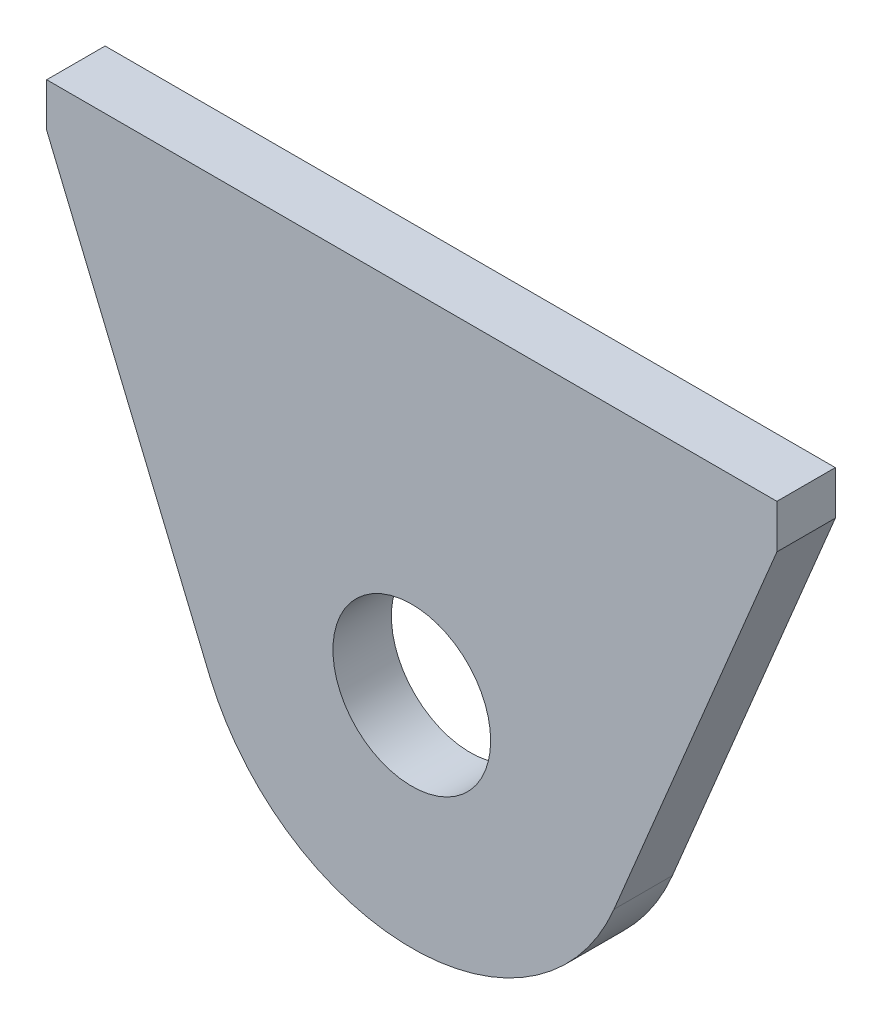
ISO-10303-21;
HEADER;
FILE_DESCRIPTION(('STEP AP214'),'2;1');
FILE_NAME('part.step','',(''),(''),'','','');
FILE_SCHEMA(('AUTOMOTIVE_DESIGN { 1 0 10303 214 1 1 1 1 }'));
ENDSEC;
DATA;
#1=APPLICATION_CONTEXT('core data for automotive mechanical design processes');
#2=APPLICATION_PROTOCOL_DEFINITION('international standard','automotive_design',2000,#1);
#3=PRODUCT_CONTEXT('',#1,'mechanical');
#4=PRODUCT('Part','Part','',(#3));
#5=PRODUCT_RELATED_PRODUCT_CATEGORY('part','',(#4));
#6=PRODUCT_DEFINITION_FORMATION('','',#4);
#7=PRODUCT_DEFINITION_CONTEXT('part definition',#1,'design');
#8=PRODUCT_DEFINITION('design','',#6,#7);
#9=PRODUCT_DEFINITION_SHAPE('','',#8);
#10=(LENGTH_UNIT() NAMED_UNIT(*) SI_UNIT(.MILLI.,.METRE.));
#11=(NAMED_UNIT(*) PLANE_ANGLE_UNIT() SI_UNIT($,.RADIAN.));
#12=(NAMED_UNIT(*) SI_UNIT($,.STERADIAN.) SOLID_ANGLE_UNIT());
#13=UNCERTAINTY_MEASURE_WITH_UNIT(LENGTH_MEASURE(1.E-05),#10,'distance_accuracy_value','');
#14=(GEOMETRIC_REPRESENTATION_CONTEXT(3) GLOBAL_UNCERTAINTY_ASSIGNED_CONTEXT((#13)) GLOBAL_UNIT_ASSIGNED_CONTEXT((#10,
#11,#12)) REPRESENTATION_CONTEXT('',''));
#15=CARTESIAN_POINT('',(0.,0.,0.));
#16=DIRECTION('',(0.,0.,1.));
#17=DIRECTION('',(1.,0.,0.));
#18=AXIS2_PLACEMENT_3D('',#15,#16,#17);
#19=CARTESIAN_POINT('',(0.,0.,4.));
#20=DIRECTION('',(0.,0.,1.));
#21=DIRECTION('',(1.,0.,0.));
#22=AXIS2_PLACEMENT_3D('',#19,#20,#21);
#23=PLANE('',#22);
#24=DIRECTION('',(0.384615384615385,-0.923076923076923,0.));
#25=VECTOR('',#24,1.);
#26=CARTESIAN_POINT('',(-25.,21.,4.));
#27=LINE('',#26,#25);
#28=CARTESIAN_POINT('',(-25.,21.,4.));
#29=VERTEX_POINT('',#28);
#30=CARTESIAN_POINT('',(-13.8461538461538,-5.76923076923077,4.));
#31=VERTEX_POINT('',#30);
#32=EDGE_CURVE('E136',#29,#31,#27,.T.);
#33=ORIENTED_EDGE('',*,*,#32,.T.);
#34=CARTESIAN_POINT('',(0.,0.,4.));
#35=DIRECTION('',(0.,0.,1.));
#36=DIRECTION('',(1.,0.,0.));
#37=AXIS2_PLACEMENT_3D('',#34,#35,#36);
#38=CIRCLE('',#37,15.);
#39=CARTESIAN_POINT('',(13.8461538461538,-5.76923076923077,4.));
#40=VERTEX_POINT('',#39);
#41=EDGE_CURVE('E92',#31,#40,#38,.T.);
#42=ORIENTED_EDGE('',*,*,#41,.T.);
#43=DIRECTION('',(0.384615384615385,0.923076923076923,0.));
#44=VECTOR('',#43,1.);
#45=CARTESIAN_POINT('',(25.,21.,4.));
#46=LINE('',#45,#44);
#47=CARTESIAN_POINT('',(25.,21.,4.));
#48=VERTEX_POINT('',#47);
#49=EDGE_CURVE('E108',#40,#48,#46,.T.);
#50=ORIENTED_EDGE('',*,*,#49,.T.);
#51=DIRECTION('',(0.,1.,0.));
#52=VECTOR('',#51,1.);
#53=CARTESIAN_POINT('',(25.,24.,4.));
#54=LINE('',#53,#52);
#55=CARTESIAN_POINT('',(25.,24.,4.));
#56=VERTEX_POINT('',#55);
#57=EDGE_CURVE('E105',#48,#56,#54,.T.);
#58=ORIENTED_EDGE('',*,*,#57,.T.);
#59=DIRECTION('',(-1.,0.,0.));
#60=VECTOR('',#59,1.);
#61=CARTESIAN_POINT('',(-25.,24.,4.));
#62=LINE('',#61,#60);
#63=CARTESIAN_POINT('',(-25.,24.,4.));
#64=VERTEX_POINT('',#63);
#65=EDGE_CURVE('E106',#56,#64,#62,.T.);
#66=ORIENTED_EDGE('',*,*,#65,.T.);
#67=DIRECTION('',(0.,-1.,0.));
#68=VECTOR('',#67,1.);
#69=CARTESIAN_POINT('',(-25.,24.,4.));
#70=LINE('',#69,#68);
#71=EDGE_CURVE('E59',#64,#29,#70,.T.);
#72=ORIENTED_EDGE('',*,*,#71,.T.);
#73=EDGE_LOOP('',(#33,#42,#50,#58,#66,#72));
#74=FACE_BOUND('',#73,.T.);
#75=CARTESIAN_POINT('',(0.,0.,4.));
#76=DIRECTION('',(0.,0.,1.));
#77=DIRECTION('',(1.,0.,0.));
#78=AXIS2_PLACEMENT_3D('',#75,#76,#77);
#79=CIRCLE('',#78,5.4);
#80=CARTESIAN_POINT('',(5.4,0.,4.));
#81=VERTEX_POINT('',#80);
#82=EDGE_CURVE('E128',#81,#81,#79,.T.);
#83=ORIENTED_EDGE('',*,*,#82,.F.);
#84=EDGE_LOOP('',(#83));
#85=FACE_BOUND('',#84,.T.);
#86=ADVANCED_FACE('F41',(#74,#85),#23,.T.);
#87=CARTESIAN_POINT('',(0.,0.,0.));
#88=DIRECTION('',(0.,0.,1.));
#89=DIRECTION('',(1.,0.,0.));
#90=AXIS2_PLACEMENT_3D('',#87,#88,#89);
#91=PLANE('',#90);
#92=DIRECTION('',(0.384615384615385,-0.923076923076923,0.));
#93=VECTOR('',#92,1.);
#94=CARTESIAN_POINT('',(-25.,21.,0.));
#95=LINE('',#94,#93);
#96=CARTESIAN_POINT('',(-25.,21.,0.));
#97=VERTEX_POINT('',#96);
#98=CARTESIAN_POINT('',(-13.8461538461538,-5.76923076923077,0.));
#99=VERTEX_POINT('',#98);
#100=EDGE_CURVE('E127',#97,#99,#95,.T.);
#101=ORIENTED_EDGE('',*,*,#100,.F.);
#102=DIRECTION('',(0.,-1.,0.));
#103=VECTOR('',#102,1.);
#104=CARTESIAN_POINT('',(-25.,24.,0.));
#105=LINE('',#104,#103);
#106=CARTESIAN_POINT('',(-25.,24.,0.));
#107=VERTEX_POINT('',#106);
#108=EDGE_CURVE('E89',#107,#97,#105,.T.);
#109=ORIENTED_EDGE('',*,*,#108,.F.);
#110=DIRECTION('',(-1.,0.,0.));
#111=VECTOR('',#110,1.);
#112=CARTESIAN_POINT('',(-25.,24.,0.));
#113=LINE('',#112,#111);
#114=CARTESIAN_POINT('',(25.,24.,0.));
#115=VERTEX_POINT('',#114);
#116=EDGE_CURVE('E82',#115,#107,#113,.T.);
#117=ORIENTED_EDGE('',*,*,#116,.F.);
#118=DIRECTION('',(0.,1.,0.));
#119=VECTOR('',#118,1.);
#120=CARTESIAN_POINT('',(25.,24.,0.));
#121=LINE('',#120,#119);
#122=CARTESIAN_POINT('',(25.,21.,0.));
#123=VERTEX_POINT('',#122);
#124=EDGE_CURVE('E116',#123,#115,#121,.T.);
#125=ORIENTED_EDGE('',*,*,#124,.F.);
#126=DIRECTION('',(0.384615384615385,0.923076923076923,0.));
#127=VECTOR('',#126,1.);
#128=CARTESIAN_POINT('',(25.,21.,0.));
#129=LINE('',#128,#127);
#130=CARTESIAN_POINT('',(13.8461538461538,-5.76923076923077,0.));
#131=VERTEX_POINT('',#130);
#132=EDGE_CURVE('E134',#131,#123,#129,.T.);
#133=ORIENTED_EDGE('',*,*,#132,.F.);
#134=CARTESIAN_POINT('',(0.,0.,0.));
#135=DIRECTION('',(0.,0.,1.));
#136=DIRECTION('',(1.,0.,0.));
#137=AXIS2_PLACEMENT_3D('',#134,#135,#136);
#138=CIRCLE('',#137,15.);
#139=EDGE_CURVE('E126',#99,#131,#138,.T.);
#140=ORIENTED_EDGE('',*,*,#139,.F.);
#141=EDGE_LOOP('',(#101,#109,#117,#125,#133,#140));
#142=FACE_BOUND('',#141,.T.);
#143=CARTESIAN_POINT('',(0.,0.,0.));
#144=DIRECTION('',(0.,0.,1.));
#145=DIRECTION('',(1.,0.,0.));
#146=AXIS2_PLACEMENT_3D('',#143,#144,#145);
#147=CIRCLE('',#146,5.4);
#148=CARTESIAN_POINT('',(5.4,0.,0.));
#149=VERTEX_POINT('',#148);
#150=EDGE_CURVE('E229',#149,#149,#147,.T.);
#151=ORIENTED_EDGE('',*,*,#150,.T.);
#152=EDGE_LOOP('',(#151));
#153=FACE_BOUND('',#152,.T.);
#154=ADVANCED_FACE('F147',(#142,#153),#91,.F.);
#155=CARTESIAN_POINT('',(-25.,21.,4.));
#156=DIRECTION('',(0.923076923076923,0.384615384615385,0.));
#157=DIRECTION('',(-0.384615384615385,0.923076923076923,0.));
#158=AXIS2_PLACEMENT_3D('',#155,#156,#157);
#159=PLANE('',#158);
#160=ORIENTED_EDGE('',*,*,#100,.T.);
#161=DIRECTION('',(0.,0.,-1.));
#162=VECTOR('',#161,1.);
#163=CARTESIAN_POINT('',(-13.8461538461538,-5.76923076923077,4.));
#164=LINE('',#163,#162);
#165=EDGE_CURVE('E11',#31,#99,#164,.T.);
#166=ORIENTED_EDGE('',*,*,#165,.F.);
#167=ORIENTED_EDGE('',*,*,#32,.F.);
#168=DIRECTION('',(0.,0.,-1.));
#169=VECTOR('',#168,1.);
#170=CARTESIAN_POINT('',(-25.,21.,4.));
#171=LINE('',#170,#169);
#172=EDGE_CURVE('E125',#29,#97,#171,.T.);
#173=ORIENTED_EDGE('',*,*,#172,.T.);
#174=EDGE_LOOP('',(#160,#166,#167,#173));
#175=FACE_BOUND('',#174,.T.);
#176=ADVANCED_FACE('F43',(#175),#159,.F.);
#177=CARTESIAN_POINT('',(0.,0.,4.));
#178=DIRECTION('',(0.,0.,-1.));
#179=DIRECTION('',(-1.,0.,0.));
#180=AXIS2_PLACEMENT_3D('',#177,#178,#179);
#181=CYLINDRICAL_SURFACE('',#180,15.);
#182=ORIENTED_EDGE('',*,*,#139,.T.);
#183=DIRECTION('',(0.,0.,-1.));
#184=VECTOR('',#183,1.);
#185=CARTESIAN_POINT('',(13.8461538461538,-5.76923076923077,4.));
#186=LINE('',#185,#184);
#187=EDGE_CURVE('E49',#40,#131,#186,.T.);
#188=ORIENTED_EDGE('',*,*,#187,.F.);
#189=ORIENTED_EDGE('',*,*,#41,.F.);
#190=ORIENTED_EDGE('',*,*,#165,.T.);
#191=EDGE_LOOP('',(#182,#188,#189,#190));
#192=FACE_BOUND('',#191,.T.);
#193=ADVANCED_FACE('F171',(#192),#181,.T.);
#194=CARTESIAN_POINT('',(25.,21.,4.));
#195=DIRECTION('',(-0.923076923076923,0.384615384615385,0.));
#196=DIRECTION('',(-0.384615384615385,-0.923076923076923,0.));
#197=AXIS2_PLACEMENT_3D('',#194,#195,#196);
#198=PLANE('',#197);
#199=ORIENTED_EDGE('',*,*,#132,.T.);
#200=DIRECTION('',(0.,0.,-1.));
#201=VECTOR('',#200,1.);
#202=CARTESIAN_POINT('',(25.,21.,4.));
#203=LINE('',#202,#201);
#204=EDGE_CURVE('E120',#48,#123,#203,.T.);
#205=ORIENTED_EDGE('',*,*,#204,.F.);
#206=ORIENTED_EDGE('',*,*,#49,.F.);
#207=ORIENTED_EDGE('',*,*,#187,.T.);
#208=EDGE_LOOP('',(#199,#205,#206,#207));
#209=FACE_BOUND('',#208,.T.);
#210=ADVANCED_FACE('F141',(#209),#198,.F.);
#211=CARTESIAN_POINT('',(25.,24.,4.));
#212=DIRECTION('',(-1.,0.,0.));
#213=DIRECTION('',(0.,0.,1.));
#214=AXIS2_PLACEMENT_3D('',#211,#212,#213);
#215=PLANE('',#214);
#216=ORIENTED_EDGE('',*,*,#124,.T.);
#217=DIRECTION('',(0.,0.,-1.));
#218=VECTOR('',#217,1.);
#219=CARTESIAN_POINT('',(25.,24.,4.));
#220=LINE('',#219,#218);
#221=EDGE_CURVE('E113',#56,#115,#220,.T.);
#222=ORIENTED_EDGE('',*,*,#221,.F.);
#223=ORIENTED_EDGE('',*,*,#57,.F.);
#224=ORIENTED_EDGE('',*,*,#204,.T.);
#225=EDGE_LOOP('',(#216,#222,#223,#224));
#226=FACE_BOUND('',#225,.T.);
#227=ADVANCED_FACE('F112',(#226),#215,.F.);
#228=CARTESIAN_POINT('',(-25.,24.,4.));
#229=DIRECTION('',(0.,-1.,0.));
#230=DIRECTION('',(0.,0.,-1.));
#231=AXIS2_PLACEMENT_3D('',#228,#229,#230);
#232=PLANE('',#231);
#233=ORIENTED_EDGE('',*,*,#116,.T.);
#234=DIRECTION('',(0.,0.,-1.));
#235=VECTOR('',#234,1.);
#236=CARTESIAN_POINT('',(-25.,24.,4.));
#237=LINE('',#236,#235);
#238=EDGE_CURVE('E117',#64,#107,#237,.T.);
#239=ORIENTED_EDGE('',*,*,#238,.F.);
#240=ORIENTED_EDGE('',*,*,#65,.F.);
#241=ORIENTED_EDGE('',*,*,#221,.T.);
#242=EDGE_LOOP('',(#233,#239,#240,#241));
#243=FACE_BOUND('',#242,.T.);
#244=ADVANCED_FACE('F119',(#243),#232,.F.);
#245=CARTESIAN_POINT('',(-25.,24.,4.));
#246=DIRECTION('',(1.,0.,0.));
#247=DIRECTION('',(0.,0.,-1.));
#248=AXIS2_PLACEMENT_3D('',#245,#246,#247);
#249=PLANE('',#248);
#250=ORIENTED_EDGE('',*,*,#108,.T.);
#251=ORIENTED_EDGE('',*,*,#172,.F.);
#252=ORIENTED_EDGE('',*,*,#71,.F.);
#253=ORIENTED_EDGE('',*,*,#238,.T.);
#254=EDGE_LOOP('',(#250,#251,#252,#253));
#255=FACE_BOUND('',#254,.T.);
#256=ADVANCED_FACE('F152',(#255),#249,.F.);
#257=CARTESIAN_POINT('',(0.,0.,4.));
#258=DIRECTION('',(0.,0.,-1.));
#259=DIRECTION('',(-1.,0.,0.));
#260=AXIS2_PLACEMENT_3D('',#257,#258,#259);
#261=CYLINDRICAL_SURFACE('',#260,5.4);
#262=ORIENTED_EDGE('',*,*,#82,.T.);
#263=EDGE_LOOP('',(#262));
#264=FACE_BOUND('',#263,.T.);
#265=ORIENTED_EDGE('',*,*,#150,.F.);
#266=EDGE_LOOP('',(#265));
#267=FACE_BOUND('',#266,.T.);
#268=ADVANCED_FACE('F155',(#264,#267),#261,.F.);
#269=CLOSED_SHELL('',(#86,#154,#176,#193,#210,#227,#244,#256,#268));
#270=MANIFOLD_SOLID_BREP('B2',#269);
#271=ADVANCED_BREP_SHAPE_REPRESENTATION('',(#18,#270),#14);
#272=SHAPE_DEFINITION_REPRESENTATION(#9,#271);
ENDSEC;
END-ISO-10303-21;
